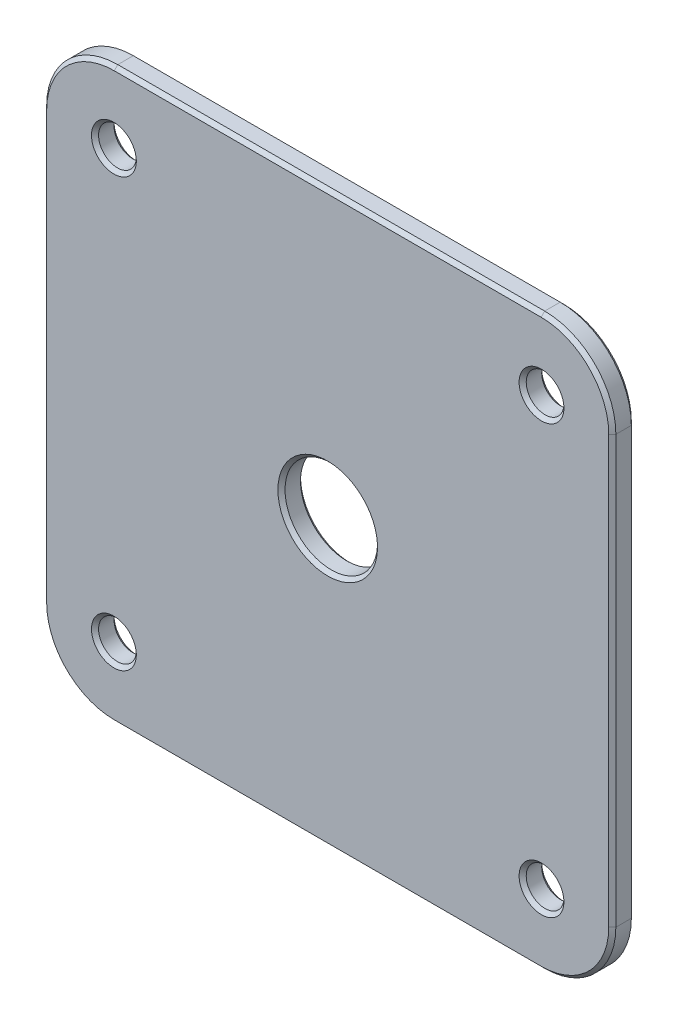
ISO-10303-21;
HEADER;
FILE_DESCRIPTION(('STEP AP214'),'2;1');
FILE_NAME('part.step','',(''),(''),'','','');
FILE_SCHEMA(('AUTOMOTIVE_DESIGN { 1 0 10303 214 1 1 1 1 }'));
ENDSEC;
DATA;
#1=APPLICATION_CONTEXT('core data for automotive mechanical design processes');
#2=APPLICATION_PROTOCOL_DEFINITION('international standard','automotive_design',2000,#1);
#3=PRODUCT_CONTEXT('',#1,'mechanical');
#4=PRODUCT('Part','Part','',(#3));
#5=PRODUCT_RELATED_PRODUCT_CATEGORY('part','',(#4));
#6=PRODUCT_DEFINITION_FORMATION('','',#4);
#7=PRODUCT_DEFINITION_CONTEXT('part definition',#1,'design');
#8=PRODUCT_DEFINITION('design','',#6,#7);
#9=PRODUCT_DEFINITION_SHAPE('','',#8);
#10=(LENGTH_UNIT() NAMED_UNIT(*) SI_UNIT(.MILLI.,.METRE.));
#11=(NAMED_UNIT(*) PLANE_ANGLE_UNIT() SI_UNIT($,.RADIAN.));
#12=(NAMED_UNIT(*) SI_UNIT($,.STERADIAN.) SOLID_ANGLE_UNIT());
#13=UNCERTAINTY_MEASURE_WITH_UNIT(LENGTH_MEASURE(1.E-05),#10,'distance_accuracy_value','');
#14=(GEOMETRIC_REPRESENTATION_CONTEXT(3) GLOBAL_UNCERTAINTY_ASSIGNED_CONTEXT((#13)) GLOBAL_UNIT_ASSIGNED_CONTEXT((#10,
#11,#12)) REPRESENTATION_CONTEXT('',''));
#15=CARTESIAN_POINT('',(0.,0.,0.));
#16=DIRECTION('',(0.,0.,1.));
#17=DIRECTION('',(1.,0.,0.));
#18=AXIS2_PLACEMENT_3D('',#15,#16,#17);
#19=CARTESIAN_POINT('',(40.,-40.,1.5875));
#20=DIRECTION('',(-1.,0.,0.));
#21=DIRECTION('',(0.,0.,1.));
#22=AXIS2_PLACEMENT_3D('',#19,#20,#21);
#23=PLANE('',#22);
#24=DIRECTION('',(0.,0.,-1.));
#25=VECTOR('',#24,1.);
#26=CARTESIAN_POINT('',(40.,30.,1.5875));
#27=LINE('',#26,#25);
#28=CARTESIAN_POINT('',(40.,30.,-1.08749999999999));
#29=VERTEX_POINT('',#28);
#30=CARTESIAN_POINT('',(40.,30.,1.0875));
#31=VERTEX_POINT('',#30);
#32=EDGE_CURVE('E352',#29,#31,#27,.F.);
#33=ORIENTED_EDGE('',*,*,#32,.T.);
#34=DIRECTION('',(0.,-1.,0.));
#35=VECTOR('',#34,1.);
#36=CARTESIAN_POINT('',(40.,-40.,1.0875));
#37=LINE('',#36,#35);
#38=CARTESIAN_POINT('',(40.,-30.,1.0875));
#39=VERTEX_POINT('',#38);
#40=EDGE_CURVE('E234',#31,#39,#37,.T.);
#41=ORIENTED_EDGE('',*,*,#40,.T.);
#42=DIRECTION('',(0.,0.,-1.));
#43=VECTOR('',#42,1.);
#44=CARTESIAN_POINT('',(40.,-30.,1.5875));
#45=LINE('',#44,#43);
#46=CARTESIAN_POINT('',(40.,-30.,-1.08749999999999));
#47=VERTEX_POINT('',#46);
#48=EDGE_CURVE('E407',#39,#47,#45,.T.);
#49=ORIENTED_EDGE('',*,*,#48,.T.);
#50=DIRECTION('',(0.,1.,0.));
#51=VECTOR('',#50,1.);
#52=CARTESIAN_POINT('',(40.,30.,-1.08749999999999));
#53=LINE('',#52,#51);
#54=EDGE_CURVE('E231',#47,#29,#53,.T.);
#55=ORIENTED_EDGE('',*,*,#54,.T.);
#56=EDGE_LOOP('',(#33,#41,#49,#55));
#57=FACE_BOUND('',#56,.T.);
#58=ADVANCED_FACE('F50',(#57),#23,.F.);
#59=CARTESIAN_POINT('',(-40.,40.,1.5875));
#60=DIRECTION('',(0.,-1.,0.));
#61=DIRECTION('',(0.,0.,-1.));
#62=AXIS2_PLACEMENT_3D('',#59,#60,#61);
#63=PLANE('',#62);
#64=DIRECTION('',(0.,0.,-1.));
#65=VECTOR('',#64,1.);
#66=CARTESIAN_POINT('',(-30.,40.,1.5875));
#67=LINE('',#66,#65);
#68=CARTESIAN_POINT('',(-30.,40.,-1.08749999999999));
#69=VERTEX_POINT('',#68);
#70=CARTESIAN_POINT('',(-30.,40.,1.0875));
#71=VERTEX_POINT('',#70);
#72=EDGE_CURVE('E426',#69,#71,#67,.F.);
#73=ORIENTED_EDGE('',*,*,#72,.T.);
#74=DIRECTION('',(1.,0.,0.));
#75=VECTOR('',#74,1.);
#76=CARTESIAN_POINT('',(-40.,40.,1.0875));
#77=LINE('',#76,#75);
#78=CARTESIAN_POINT('',(30.,40.,1.0875));
#79=VERTEX_POINT('',#78);
#80=EDGE_CURVE('E221',#71,#79,#77,.T.);
#81=ORIENTED_EDGE('',*,*,#80,.T.);
#82=DIRECTION('',(0.,0.,-1.));
#83=VECTOR('',#82,1.);
#84=CARTESIAN_POINT('',(30.,40.,1.5875));
#85=LINE('',#84,#83);
#86=CARTESIAN_POINT('',(30.,40.,-1.08749999999999));
#87=VERTEX_POINT('',#86);
#88=EDGE_CURVE('E422',#79,#87,#85,.T.);
#89=ORIENTED_EDGE('',*,*,#88,.T.);
#90=DIRECTION('',(-1.,0.,0.));
#91=VECTOR('',#90,1.);
#92=CARTESIAN_POINT('',(-30.,40.,-1.08749999999999));
#93=LINE('',#92,#91);
#94=EDGE_CURVE('E218',#87,#69,#93,.T.);
#95=ORIENTED_EDGE('',*,*,#94,.T.);
#96=EDGE_LOOP('',(#73,#81,#89,#95));
#97=FACE_BOUND('',#96,.T.);
#98=ADVANCED_FACE('F518',(#97),#63,.F.);
#99=CARTESIAN_POINT('',(-40.,-40.,1.5875));
#100=DIRECTION('',(1.,0.,0.));
#101=DIRECTION('',(0.,0.,-1.));
#102=AXIS2_PLACEMENT_3D('',#99,#100,#101);
#103=PLANE('',#102);
#104=DIRECTION('',(0.,0.,-1.));
#105=VECTOR('',#104,1.);
#106=CARTESIAN_POINT('',(-40.,-30.,1.5875));
#107=LINE('',#106,#105);
#108=CARTESIAN_POINT('',(-40.,-30.,-1.08749999999999));
#109=VERTEX_POINT('',#108);
#110=CARTESIAN_POINT('',(-40.,-30.,1.0875));
#111=VERTEX_POINT('',#110);
#112=EDGE_CURVE('E400',#109,#111,#107,.F.);
#113=ORIENTED_EDGE('',*,*,#112,.T.);
#114=DIRECTION('',(0.,1.,0.));
#115=VECTOR('',#114,1.);
#116=CARTESIAN_POINT('',(-40.,-40.,1.0875));
#117=LINE('',#116,#115);
#118=CARTESIAN_POINT('',(-40.,30.,1.0875));
#119=VERTEX_POINT('',#118);
#120=EDGE_CURVE('E209',#111,#119,#117,.T.);
#121=ORIENTED_EDGE('',*,*,#120,.T.);
#122=DIRECTION('',(0.,0.,-1.));
#123=VECTOR('',#122,1.);
#124=CARTESIAN_POINT('',(-40.,30.,1.5875));
#125=LINE('',#124,#123);
#126=CARTESIAN_POINT('',(-40.,30.,-1.08749999999999));
#127=VERTEX_POINT('',#126);
#128=EDGE_CURVE('E411',#119,#127,#125,.T.);
#129=ORIENTED_EDGE('',*,*,#128,.T.);
#130=DIRECTION('',(0.,-1.,0.));
#131=VECTOR('',#130,1.);
#132=CARTESIAN_POINT('',(-40.,-30.,-1.08749999999999));
#133=LINE('',#132,#131);
#134=EDGE_CURVE('E206',#127,#109,#133,.T.);
#135=ORIENTED_EDGE('',*,*,#134,.T.);
#136=EDGE_LOOP('',(#113,#121,#129,#135));
#137=FACE_BOUND('',#136,.T.);
#138=ADVANCED_FACE('F472',(#137),#103,.F.);
#139=CARTESIAN_POINT('',(-40.,-40.,1.5875));
#140=DIRECTION('',(0.,1.,0.));
#141=DIRECTION('',(0.,0.,1.));
#142=AXIS2_PLACEMENT_3D('',#139,#140,#141);
#143=PLANE('',#142);
#144=DIRECTION('',(0.,0.,-1.));
#145=VECTOR('',#144,1.);
#146=CARTESIAN_POINT('',(30.,-40.,1.5875));
#147=LINE('',#146,#145);
#148=CARTESIAN_POINT('',(30.,-40.,-1.08749999999999));
#149=VERTEX_POINT('',#148);
#150=CARTESIAN_POINT('',(30.,-40.,1.0875));
#151=VERTEX_POINT('',#150);
#152=EDGE_CURVE('E406',#149,#151,#147,.F.);
#153=ORIENTED_EDGE('',*,*,#152,.T.);
#154=DIRECTION('',(-1.,0.,0.));
#155=VECTOR('',#154,1.);
#156=CARTESIAN_POINT('',(-40.,-40.,1.0875));
#157=LINE('',#156,#155);
#158=CARTESIAN_POINT('',(-30.,-40.,1.0875));
#159=VERTEX_POINT('',#158);
#160=EDGE_CURVE('E246',#151,#159,#157,.T.);
#161=ORIENTED_EDGE('',*,*,#160,.T.);
#162=DIRECTION('',(0.,0.,-1.));
#163=VECTOR('',#162,1.);
#164=CARTESIAN_POINT('',(-30.,-40.,1.5875));
#165=LINE('',#164,#163);
#166=CARTESIAN_POINT('',(-30.,-40.,-1.08749999999999));
#167=VERTEX_POINT('',#166);
#168=EDGE_CURVE('E398',#159,#167,#165,.T.);
#169=ORIENTED_EDGE('',*,*,#168,.T.);
#170=DIRECTION('',(1.,0.,0.));
#171=VECTOR('',#170,1.);
#172=CARTESIAN_POINT('',(30.,-40.,-1.08749999999999));
#173=LINE('',#172,#171);
#174=EDGE_CURVE('E243',#167,#149,#173,.T.);
#175=ORIENTED_EDGE('',*,*,#174,.T.);
#176=EDGE_LOOP('',(#153,#161,#169,#175));
#177=FACE_BOUND('',#176,.T.);
#178=ADVANCED_FACE('F403',(#177),#143,.F.);
#179=CARTESIAN_POINT('',(0.,0.,1.5875));
#180=DIRECTION('',(0.,0.,-1.));
#181=DIRECTION('',(-1.,0.,0.));
#182=AXIS2_PLACEMENT_3D('',#179,#180,#181);
#183=PLANE('',#182);
#184=DIRECTION('',(0.,-1.,0.));
#185=VECTOR('',#184,1.);
#186=CARTESIAN_POINT('',(-39.5,0.,1.5875));
#187=LINE('',#186,#185);
#188=CARTESIAN_POINT('',(-39.5,30.,1.5875));
#189=VERTEX_POINT('',#188);
#190=CARTESIAN_POINT('',(-39.5,-30.,1.5875));
#191=VERTEX_POINT('',#190);
#192=EDGE_CURVE('E192',#189,#191,#187,.T.);
#193=ORIENTED_EDGE('',*,*,#192,.T.);
#194=CARTESIAN_POINT('',(-30.,-30.,1.5875));
#195=DIRECTION('',(0.,0.,-1.));
#196=DIRECTION('',(-1.,0.,0.));
#197=AXIS2_PLACEMENT_3D('',#194,#195,#196);
#198=CIRCLE('',#197,9.5);
#199=CARTESIAN_POINT('',(-30.,-39.5,1.5875));
#200=VERTEX_POINT('',#199);
#201=EDGE_CURVE('E170',#191,#200,#198,.F.);
#202=ORIENTED_EDGE('',*,*,#201,.T.);
#203=DIRECTION('',(1.,0.,0.));
#204=VECTOR('',#203,1.);
#205=CARTESIAN_POINT('',(0.,-39.5,1.5875));
#206=LINE('',#205,#204);
#207=CARTESIAN_POINT('',(30.,-39.5,1.5875));
#208=VERTEX_POINT('',#207);
#209=EDGE_CURVE('E179',#200,#208,#206,.T.);
#210=ORIENTED_EDGE('',*,*,#209,.T.);
#211=CARTESIAN_POINT('',(30.,-30.,1.5875));
#212=DIRECTION('',(0.,0.,-1.));
#213=DIRECTION('',(-1.,0.,0.));
#214=AXIS2_PLACEMENT_3D('',#211,#212,#213);
#215=CIRCLE('',#214,9.5);
#216=CARTESIAN_POINT('',(39.5,-30.,1.5875));
#217=VERTEX_POINT('',#216);
#218=EDGE_CURVE('E186',#208,#217,#215,.F.);
#219=ORIENTED_EDGE('',*,*,#218,.T.);
#220=DIRECTION('',(0.,1.,0.));
#221=VECTOR('',#220,1.);
#222=CARTESIAN_POINT('',(39.5,0.,1.5875));
#223=LINE('',#222,#221);
#224=CARTESIAN_POINT('',(39.5,30.,1.5875));
#225=VERTEX_POINT('',#224);
#226=EDGE_CURVE('E451',#217,#225,#223,.T.);
#227=ORIENTED_EDGE('',*,*,#226,.T.);
#228=CARTESIAN_POINT('',(30.,30.,1.5875));
#229=DIRECTION('',(0.,0.,-1.));
#230=DIRECTION('',(-1.,0.,0.));
#231=AXIS2_PLACEMENT_3D('',#228,#229,#230);
#232=CIRCLE('',#231,9.5);
#233=CARTESIAN_POINT('',(30.,39.5,1.5875));
#234=VERTEX_POINT('',#233);
#235=EDGE_CURVE('E454',#225,#234,#232,.F.);
#236=ORIENTED_EDGE('',*,*,#235,.T.);
#237=DIRECTION('',(-1.,0.,0.));
#238=VECTOR('',#237,1.);
#239=CARTESIAN_POINT('',(0.,39.5,1.5875));
#240=LINE('',#239,#238);
#241=CARTESIAN_POINT('',(-30.,39.5,1.5875));
#242=VERTEX_POINT('',#241);
#243=EDGE_CURVE('E457',#234,#242,#240,.T.);
#244=ORIENTED_EDGE('',*,*,#243,.T.);
#245=CARTESIAN_POINT('',(-30.,30.,1.5875));
#246=DIRECTION('',(0.,0.,-1.));
#247=DIRECTION('',(-1.,0.,0.));
#248=AXIS2_PLACEMENT_3D('',#245,#246,#247);
#249=CIRCLE('',#248,9.5);
#250=EDGE_CURVE('E200',#242,#189,#249,.F.);
#251=ORIENTED_EDGE('',*,*,#250,.T.);
#252=EDGE_LOOP('',(#193,#202,#210,#219,#227,#236,#244,#251));
#253=FACE_BOUND('',#252,.T.);
#254=CARTESIAN_POINT('',(-30.0520382004283,-30.0520382004283,1.5875));
#255=DIRECTION('',(0.,0.,-1.));
#256=DIRECTION('',(-1.,0.,0.));
#257=AXIS2_PLACEMENT_3D('',#254,#255,#256);
#258=CIRCLE('',#257,3.14999999999999);
#259=CARTESIAN_POINT('',(-33.2020382004283,-30.0520382004283,1.5875));
#260=VERTEX_POINT('',#259);
#261=EDGE_CURVE('E187',#260,#260,#258,.T.);
#262=ORIENTED_EDGE('',*,*,#261,.T.);
#263=EDGE_LOOP('',(#262));
#264=FACE_BOUND('',#263,.T.);
#265=CARTESIAN_POINT('',(30.0520382004283,-30.0520382004283,1.5875));
#266=DIRECTION('',(0.,0.,-1.));
#267=DIRECTION('',(-1.,0.,0.));
#268=AXIS2_PLACEMENT_3D('',#265,#266,#267);
#269=CIRCLE('',#268,3.14999999999998);
#270=CARTESIAN_POINT('',(26.9020382004283,-30.0520382004283,1.5875));
#271=VERTEX_POINT('',#270);
#272=EDGE_CURVE('E442',#271,#271,#269,.T.);
#273=ORIENTED_EDGE('',*,*,#272,.T.);
#274=EDGE_LOOP('',(#273));
#275=FACE_BOUND('',#274,.T.);
#276=CARTESIAN_POINT('',(30.0520382004283,30.0520382004283,1.5875));
#277=DIRECTION('',(0.,0.,-1.));
#278=DIRECTION('',(-1.,0.,0.));
#279=AXIS2_PLACEMENT_3D('',#276,#277,#278);
#280=CIRCLE('',#279,3.14999999999998);
#281=CARTESIAN_POINT('',(26.9020382004283,30.0520382004283,1.5875));
#282=VERTEX_POINT('',#281);
#283=EDGE_CURVE('E438',#282,#282,#280,.T.);
#284=ORIENTED_EDGE('',*,*,#283,.T.);
#285=EDGE_LOOP('',(#284));
#286=FACE_BOUND('',#285,.T.);
#287=CARTESIAN_POINT('',(-30.0520382004283,30.0520382004283,1.5875));
#288=DIRECTION('',(0.,0.,-1.));
#289=DIRECTION('',(-1.,0.,0.));
#290=AXIS2_PLACEMENT_3D('',#287,#288,#289);
#291=CIRCLE('',#290,3.14999999999999);
#292=CARTESIAN_POINT('',(-33.2020382004283,30.0520382004283,1.5875));
#293=VERTEX_POINT('',#292);
#294=EDGE_CURVE('E434',#293,#293,#291,.T.);
#295=ORIENTED_EDGE('',*,*,#294,.T.);
#296=EDGE_LOOP('',(#295));
#297=FACE_BOUND('',#296,.T.);
#298=CARTESIAN_POINT('',(0.,0.,1.5875));
#299=DIRECTION('',(0.,0.,-1.));
#300=DIRECTION('',(-1.,0.,0.));
#301=AXIS2_PLACEMENT_3D('',#298,#299,#300);
#302=CIRCLE('',#301,6.99999999999999);
#303=CARTESIAN_POINT('',(-6.99999999999999,0.,1.5875));
#304=VERTEX_POINT('',#303);
#305=EDGE_CURVE('E430',#304,#304,#302,.T.);
#306=ORIENTED_EDGE('',*,*,#305,.T.);
#307=EDGE_LOOP('',(#306));
#308=FACE_BOUND('',#307,.T.);
#309=ADVANCED_FACE('F189',(#253,#264,#275,#286,#297,#308),#183,.F.);
#310=CARTESIAN_POINT('',(0.,0.,-1.5875));
#311=DIRECTION('',(0.,0.,-1.));
#312=DIRECTION('',(-1.,0.,0.));
#313=AXIS2_PLACEMENT_3D('',#310,#311,#312);
#314=PLANE('',#313);
#315=DIRECTION('',(1.,0.,0.));
#316=VECTOR('',#315,1.);
#317=CARTESIAN_POINT('',(30.,39.5,-1.5875));
#318=LINE('',#317,#316);
#319=CARTESIAN_POINT('',(-30.,39.5,-1.5875));
#320=VERTEX_POINT('',#319);
#321=CARTESIAN_POINT('',(30.,39.5,-1.5875));
#322=VERTEX_POINT('',#321);
#323=EDGE_CURVE('E61',#320,#322,#318,.T.);
#324=ORIENTED_EDGE('',*,*,#323,.T.);
#325=CARTESIAN_POINT('',(30.,30.,-1.5875));
#326=DIRECTION('',(0.,0.,-1.));
#327=DIRECTION('',(-1.,0.,0.));
#328=AXIS2_PLACEMENT_3D('',#325,#326,#327);
#329=CIRCLE('',#328,9.49999999999999);
#330=CARTESIAN_POINT('',(39.5,30.,-1.5875));
#331=VERTEX_POINT('',#330);
#332=EDGE_CURVE('E12',#322,#331,#329,.T.);
#333=ORIENTED_EDGE('',*,*,#332,.T.);
#334=DIRECTION('',(0.,-1.,0.));
#335=VECTOR('',#334,1.);
#336=CARTESIAN_POINT('',(39.5,-30.,-1.5875));
#337=LINE('',#336,#335);
#338=CARTESIAN_POINT('',(39.5,-30.,-1.5875));
#339=VERTEX_POINT('',#338);
#340=EDGE_CURVE('E309',#331,#339,#337,.T.);
#341=ORIENTED_EDGE('',*,*,#340,.T.);
#342=CARTESIAN_POINT('',(30.,-30.,-1.5875));
#343=DIRECTION('',(0.,0.,-1.));
#344=DIRECTION('',(-1.,0.,0.));
#345=AXIS2_PLACEMENT_3D('',#342,#343,#344);
#346=CIRCLE('',#345,9.49999999999999);
#347=CARTESIAN_POINT('',(30.,-39.5,-1.5875));
#348=VERTEX_POINT('',#347);
#349=EDGE_CURVE('E312',#339,#348,#346,.T.);
#350=ORIENTED_EDGE('',*,*,#349,.T.);
#351=DIRECTION('',(-1.,0.,0.));
#352=VECTOR('',#351,1.);
#353=CARTESIAN_POINT('',(-30.,-39.5,-1.5875));
#354=LINE('',#353,#352);
#355=CARTESIAN_POINT('',(-30.,-39.5,-1.5875));
#356=VERTEX_POINT('',#355);
#357=EDGE_CURVE('E315',#348,#356,#354,.T.);
#358=ORIENTED_EDGE('',*,*,#357,.T.);
#359=CARTESIAN_POINT('',(-30.,-30.,-1.5875));
#360=DIRECTION('',(0.,0.,-1.));
#361=DIRECTION('',(-1.,0.,0.));
#362=AXIS2_PLACEMENT_3D('',#359,#360,#361);
#363=CIRCLE('',#362,9.49999999999999);
#364=CARTESIAN_POINT('',(-39.5,-30.,-1.5875));
#365=VERTEX_POINT('',#364);
#366=EDGE_CURVE('E318',#356,#365,#363,.T.);
#367=ORIENTED_EDGE('',*,*,#366,.T.);
#368=DIRECTION('',(0.,1.,0.));
#369=VECTOR('',#368,1.);
#370=CARTESIAN_POINT('',(-39.5,30.,-1.5875));
#371=LINE('',#370,#369);
#372=CARTESIAN_POINT('',(-39.5,30.,-1.5875));
#373=VERTEX_POINT('',#372);
#374=EDGE_CURVE('E321',#365,#373,#371,.T.);
#375=ORIENTED_EDGE('',*,*,#374,.T.);
#376=CARTESIAN_POINT('',(-30.,30.,-1.5875));
#377=DIRECTION('',(0.,0.,-1.));
#378=DIRECTION('',(-1.,0.,0.));
#379=AXIS2_PLACEMENT_3D('',#376,#377,#378);
#380=CIRCLE('',#379,9.49999999999999);
#381=EDGE_CURVE('E72',#373,#320,#380,.T.);
#382=ORIENTED_EDGE('',*,*,#381,.T.);
#383=EDGE_LOOP('',(#324,#333,#341,#350,#358,#367,#375,#382));
#384=FACE_BOUND('',#383,.T.);
#385=CARTESIAN_POINT('',(-30.0520382004283,-30.0520382004283,-1.5875));
#386=DIRECTION('',(0.,0.,-1.));
#387=DIRECTION('',(-1.,0.,0.));
#388=AXIS2_PLACEMENT_3D('',#385,#386,#387);
#389=CIRCLE('',#388,3.14999999999999);
#390=CARTESIAN_POINT('',(-33.2020382004283,-30.0520382004283,-1.5875));
#391=VERTEX_POINT('',#390);
#392=EDGE_CURVE('E305',#391,#391,#389,.F.);
#393=ORIENTED_EDGE('',*,*,#392,.T.);
#394=EDGE_LOOP('',(#393));
#395=FACE_BOUND('',#394,.T.);
#396=CARTESIAN_POINT('',(30.0520382004283,-30.0520382004283,-1.5875));
#397=DIRECTION('',(0.,0.,-1.));
#398=DIRECTION('',(-1.,0.,0.));
#399=AXIS2_PLACEMENT_3D('',#396,#397,#398);
#400=CIRCLE('',#399,3.14999999999998);
#401=CARTESIAN_POINT('',(26.9020382004283,-30.0520382004283,-1.5875));
#402=VERTEX_POINT('',#401);
#403=EDGE_CURVE('E301',#402,#402,#400,.F.);
#404=ORIENTED_EDGE('',*,*,#403,.T.);
#405=EDGE_LOOP('',(#404));
#406=FACE_BOUND('',#405,.T.);
#407=CARTESIAN_POINT('',(30.0520382004283,30.0520382004283,-1.5875));
#408=DIRECTION('',(0.,0.,-1.));
#409=DIRECTION('',(-1.,0.,0.));
#410=AXIS2_PLACEMENT_3D('',#407,#408,#409);
#411=CIRCLE('',#410,3.14999999999998);
#412=CARTESIAN_POINT('',(26.9020382004283,30.0520382004283,-1.5875));
#413=VERTEX_POINT('',#412);
#414=EDGE_CURVE('E297',#413,#413,#411,.F.);
#415=ORIENTED_EDGE('',*,*,#414,.T.);
#416=EDGE_LOOP('',(#415));
#417=FACE_BOUND('',#416,.T.);
#418=CARTESIAN_POINT('',(-30.0520382004283,30.0520382004283,-1.5875));
#419=DIRECTION('',(0.,0.,-1.));
#420=DIRECTION('',(-1.,0.,0.));
#421=AXIS2_PLACEMENT_3D('',#418,#419,#420);
#422=CIRCLE('',#421,3.14999999999999);
#423=CARTESIAN_POINT('',(-33.2020382004283,30.0520382004283,-1.5875));
#424=VERTEX_POINT('',#423);
#425=EDGE_CURVE('E293',#424,#424,#422,.F.);
#426=ORIENTED_EDGE('',*,*,#425,.T.);
#427=EDGE_LOOP('',(#426));
#428=FACE_BOUND('',#427,.T.);
#429=CARTESIAN_POINT('',(0.,0.,-1.5875));
#430=DIRECTION('',(0.,0.,-1.));
#431=DIRECTION('',(-1.,0.,0.));
#432=AXIS2_PLACEMENT_3D('',#429,#430,#431);
#433=CIRCLE('',#432,7.00000000000001);
#434=CARTESIAN_POINT('',(-7.00000000000001,0.,-1.5875));
#435=VERTEX_POINT('',#434);
#436=EDGE_CURVE('E289',#435,#435,#433,.F.);
#437=ORIENTED_EDGE('',*,*,#436,.T.);
#438=EDGE_LOOP('',(#437));
#439=FACE_BOUND('',#438,.T.);
#440=ADVANCED_FACE('F488',(#384,#395,#406,#417,#428,#439),#314,.T.);
#441=CARTESIAN_POINT('',(-30.0520382004283,-30.0520382004283,-1.5875));
#442=DIRECTION('',(0.,0.,-1.));
#443=DIRECTION('',(-1.,0.,0.));
#444=AXIS2_PLACEMENT_3D('',#441,#442,#443);
#445=CYLINDRICAL_SURFACE('',#444,2.64999999999999);
#446=CARTESIAN_POINT('',(-30.0520382004283,-30.0520382004283,1.08750000000001));
#447=DIRECTION('',(0.,0.,-1.));
#448=DIRECTION('',(-1.,0.,0.));
#449=AXIS2_PLACEMENT_3D('',#446,#447,#448);
#450=CIRCLE('',#449,2.64999999999999);
#451=CARTESIAN_POINT('',(-32.7020382004283,-30.0520382004283,1.08750000000001));
#452=VERTEX_POINT('',#451);
#453=EDGE_CURVE('E253',#452,#452,#450,.F.);
#454=ORIENTED_EDGE('',*,*,#453,.T.);
#455=EDGE_LOOP('',(#454));
#456=FACE_BOUND('',#455,.T.);
#457=CARTESIAN_POINT('',(-30.0520382004283,-30.0520382004283,-1.08750000000001));
#458=DIRECTION('',(0.,0.,-1.));
#459=DIRECTION('',(-1.,0.,0.));
#460=AXIS2_PLACEMENT_3D('',#457,#458,#459);
#461=CIRCLE('',#460,2.64999999999999);
#462=CARTESIAN_POINT('',(-32.7020382004283,-30.0520382004283,-1.08750000000001));
#463=VERTEX_POINT('',#462);
#464=EDGE_CURVE('E249',#463,#463,#461,.T.);
#465=ORIENTED_EDGE('',*,*,#464,.T.);
#466=EDGE_LOOP('',(#465));
#467=FACE_BOUND('',#466,.T.);
#468=ADVANCED_FACE('F711',(#456,#467),#445,.F.);
#469=CARTESIAN_POINT('',(30.0520382004283,-30.0520382004283,-1.5875));
#470=DIRECTION('',(0.,0.,-1.));
#471=DIRECTION('',(-1.,0.,0.));
#472=AXIS2_PLACEMENT_3D('',#469,#470,#471);
#473=CYLINDRICAL_SURFACE('',#472,2.64999999999999);
#474=CARTESIAN_POINT('',(30.0520382004283,-30.0520382004283,1.08750000000001));
#475=DIRECTION('',(0.,0.,-1.));
#476=DIRECTION('',(-1.,0.,0.));
#477=AXIS2_PLACEMENT_3D('',#474,#475,#476);
#478=CIRCLE('',#477,2.64999999999999);
#479=CARTESIAN_POINT('',(27.4020382004283,-30.0520382004283,1.08750000000001));
#480=VERTEX_POINT('',#479);
#481=EDGE_CURVE('E261',#480,#480,#478,.F.);
#482=ORIENTED_EDGE('',*,*,#481,.T.);
#483=EDGE_LOOP('',(#482));
#484=FACE_BOUND('',#483,.T.);
#485=CARTESIAN_POINT('',(30.0520382004283,-30.0520382004283,-1.08750000000001));
#486=DIRECTION('',(0.,0.,-1.));
#487=DIRECTION('',(-1.,0.,0.));
#488=AXIS2_PLACEMENT_3D('',#485,#486,#487);
#489=CIRCLE('',#488,2.64999999999999);
#490=CARTESIAN_POINT('',(27.4020382004283,-30.0520382004283,-1.08750000000001));
#491=VERTEX_POINT('',#490);
#492=EDGE_CURVE('E257',#491,#491,#489,.T.);
#493=ORIENTED_EDGE('',*,*,#492,.T.);
#494=EDGE_LOOP('',(#493));
#495=FACE_BOUND('',#494,.T.);
#496=ADVANCED_FACE('F705',(#484,#495),#473,.F.);
#497=CARTESIAN_POINT('',(30.0520382004283,30.0520382004283,-1.5875));
#498=DIRECTION('',(0.,0.,-1.));
#499=DIRECTION('',(-1.,0.,0.));
#500=AXIS2_PLACEMENT_3D('',#497,#498,#499);
#501=CYLINDRICAL_SURFACE('',#500,2.64999999999999);
#502=CARTESIAN_POINT('',(30.0520382004283,30.0520382004283,1.08750000000001));
#503=DIRECTION('',(0.,0.,-1.));
#504=DIRECTION('',(-1.,0.,0.));
#505=AXIS2_PLACEMENT_3D('',#502,#503,#504);
#506=CIRCLE('',#505,2.64999999999999);
#507=CARTESIAN_POINT('',(27.4020382004283,30.0520382004283,1.08750000000001));
#508=VERTEX_POINT('',#507);
#509=EDGE_CURVE('E269',#508,#508,#506,.F.);
#510=ORIENTED_EDGE('',*,*,#509,.T.);
#511=EDGE_LOOP('',(#510));
#512=FACE_BOUND('',#511,.T.);
#513=CARTESIAN_POINT('',(30.0520382004283,30.0520382004283,-1.08750000000001));
#514=DIRECTION('',(0.,0.,-1.));
#515=DIRECTION('',(-1.,0.,0.));
#516=AXIS2_PLACEMENT_3D('',#513,#514,#515);
#517=CIRCLE('',#516,2.64999999999999);
#518=CARTESIAN_POINT('',(27.4020382004283,30.0520382004283,-1.08750000000001));
#519=VERTEX_POINT('',#518);
#520=EDGE_CURVE('E265',#519,#519,#517,.T.);
#521=ORIENTED_EDGE('',*,*,#520,.T.);
#522=EDGE_LOOP('',(#521));
#523=FACE_BOUND('',#522,.T.);
#524=ADVANCED_FACE('F696',(#512,#523),#501,.F.);
#525=CARTESIAN_POINT('',(-30.0520382004283,30.0520382004283,-1.5875));
#526=DIRECTION('',(0.,0.,-1.));
#527=DIRECTION('',(-1.,0.,0.));
#528=AXIS2_PLACEMENT_3D('',#525,#526,#527);
#529=CYLINDRICAL_SURFACE('',#528,2.64999999999999);
#530=CARTESIAN_POINT('',(-30.0520382004283,30.0520382004283,1.08750000000001));
#531=DIRECTION('',(0.,0.,-1.));
#532=DIRECTION('',(-1.,0.,0.));
#533=AXIS2_PLACEMENT_3D('',#530,#531,#532);
#534=CIRCLE('',#533,2.64999999999999);
#535=CARTESIAN_POINT('',(-32.7020382004283,30.0520382004283,1.08750000000001));
#536=VERTEX_POINT('',#535);
#537=EDGE_CURVE('E277',#536,#536,#534,.F.);
#538=ORIENTED_EDGE('',*,*,#537,.T.);
#539=EDGE_LOOP('',(#538));
#540=FACE_BOUND('',#539,.T.);
#541=CARTESIAN_POINT('',(-30.0520382004283,30.0520382004283,-1.08750000000001));
#542=DIRECTION('',(0.,0.,-1.));
#543=DIRECTION('',(-1.,0.,0.));
#544=AXIS2_PLACEMENT_3D('',#541,#542,#543);
#545=CIRCLE('',#544,2.64999999999999);
#546=CARTESIAN_POINT('',(-32.7020382004283,30.0520382004283,-1.08750000000001));
#547=VERTEX_POINT('',#546);
#548=EDGE_CURVE('E273',#547,#547,#545,.T.);
#549=ORIENTED_EDGE('',*,*,#548,.T.);
#550=EDGE_LOOP('',(#549));
#551=FACE_BOUND('',#550,.T.);
#552=ADVANCED_FACE('F694',(#540,#551),#529,.F.);
#553=CARTESIAN_POINT('',(0.,0.,1.5875));
#554=DIRECTION('',(0.,0.,1.));
#555=DIRECTION('',(1.,0.,0.));
#556=AXIS2_PLACEMENT_3D('',#553,#554,#555);
#557=CYLINDRICAL_SURFACE('',#556,6.49999999999999);
#558=CARTESIAN_POINT('',(0.,0.,1.08749999999999));
#559=DIRECTION('',(0.,0.,-1.));
#560=DIRECTION('',(-1.,0.,0.));
#561=AXIS2_PLACEMENT_3D('',#558,#559,#560);
#562=CIRCLE('',#561,6.49999999999999);
#563=CARTESIAN_POINT('',(-6.49999999999999,0.,1.08749999999999));
#564=VERTEX_POINT('',#563);
#565=EDGE_CURVE('E285',#564,#564,#562,.F.);
#566=ORIENTED_EDGE('',*,*,#565,.T.);
#567=EDGE_LOOP('',(#566));
#568=FACE_BOUND('',#567,.T.);
#569=CARTESIAN_POINT('',(0.,0.,-1.08749999999998));
#570=DIRECTION('',(0.,0.,-1.));
#571=DIRECTION('',(-1.,0.,0.));
#572=AXIS2_PLACEMENT_3D('',#569,#570,#571);
#573=CIRCLE('',#572,6.49999999999999);
#574=CARTESIAN_POINT('',(-6.49999999999999,0.,-1.08749999999998));
#575=VERTEX_POINT('',#574);
#576=EDGE_CURVE('E281',#575,#575,#573,.T.);
#577=ORIENTED_EDGE('',*,*,#576,.T.);
#578=EDGE_LOOP('',(#577));
#579=FACE_BOUND('',#578,.T.);
#580=ADVANCED_FACE('F532',(#568,#579),#557,.F.);
#581=CARTESIAN_POINT('',(30.,-30.,1.5875));
#582=DIRECTION('',(0.,0.,-1.));
#583=DIRECTION('',(-1.,0.,0.));
#584=AXIS2_PLACEMENT_3D('',#581,#582,#583);
#585=CYLINDRICAL_SURFACE('',#584,10.);
#586=ORIENTED_EDGE('',*,*,#48,.F.);
#587=CARTESIAN_POINT('',(30.,-30.,1.0875));
#588=DIRECTION('',(0.,0.,-1.));
#589=DIRECTION('',(-1.,0.,0.));
#590=AXIS2_PLACEMENT_3D('',#587,#588,#589);
#591=CIRCLE('',#590,10.);
#592=EDGE_CURVE('E240',#39,#151,#591,.T.);
#593=ORIENTED_EDGE('',*,*,#592,.T.);
#594=ORIENTED_EDGE('',*,*,#152,.F.);
#595=CARTESIAN_POINT('',(30.,-30.,-1.08749999999999));
#596=DIRECTION('',(0.,0.,-1.));
#597=DIRECTION('',(-1.,0.,0.));
#598=AXIS2_PLACEMENT_3D('',#595,#596,#597);
#599=CIRCLE('',#598,10.);
#600=EDGE_CURVE('E237',#149,#47,#599,.F.);
#601=ORIENTED_EDGE('',*,*,#600,.T.);
#602=EDGE_LOOP('',(#586,#593,#594,#601));
#603=FACE_BOUND('',#602,.T.);
#604=ADVANCED_FACE('F529',(#603),#585,.T.);
#605=CARTESIAN_POINT('',(-30.,-30.,1.5875));
#606=DIRECTION('',(0.,0.,-1.));
#607=DIRECTION('',(-1.,0.,0.));
#608=AXIS2_PLACEMENT_3D('',#605,#606,#607);
#609=CYLINDRICAL_SURFACE('',#608,10.);
#610=ORIENTED_EDGE('',*,*,#168,.F.);
#611=CARTESIAN_POINT('',(-30.,-30.,1.0875));
#612=DIRECTION('',(0.,0.,-1.));
#613=DIRECTION('',(-1.,0.,0.));
#614=AXIS2_PLACEMENT_3D('',#611,#612,#613);
#615=CIRCLE('',#614,10.);
#616=EDGE_CURVE('E172',#159,#111,#615,.T.);
#617=ORIENTED_EDGE('',*,*,#616,.T.);
#618=ORIENTED_EDGE('',*,*,#112,.F.);
#619=CARTESIAN_POINT('',(-30.,-30.,-1.08749999999999));
#620=DIRECTION('',(0.,0.,-1.));
#621=DIRECTION('',(-1.,0.,0.));
#622=AXIS2_PLACEMENT_3D('',#619,#620,#621);
#623=CIRCLE('',#622,10.);
#624=EDGE_CURVE('E195',#109,#167,#623,.F.);
#625=ORIENTED_EDGE('',*,*,#624,.T.);
#626=EDGE_LOOP('',(#610,#617,#618,#625));
#627=FACE_BOUND('',#626,.T.);
#628=ADVANCED_FACE('F397',(#627),#609,.T.);
#629=CARTESIAN_POINT('',(-30.,30.,1.5875));
#630=DIRECTION('',(0.,0.,-1.));
#631=DIRECTION('',(-1.,0.,0.));
#632=AXIS2_PLACEMENT_3D('',#629,#630,#631);
#633=CYLINDRICAL_SURFACE('',#632,10.);
#634=ORIENTED_EDGE('',*,*,#128,.F.);
#635=CARTESIAN_POINT('',(-30.,30.,1.0875));
#636=DIRECTION('',(0.,0.,-1.));
#637=DIRECTION('',(-1.,0.,0.));
#638=AXIS2_PLACEMENT_3D('',#635,#636,#637);
#639=CIRCLE('',#638,10.);
#640=EDGE_CURVE('E215',#119,#71,#639,.T.);
#641=ORIENTED_EDGE('',*,*,#640,.T.);
#642=ORIENTED_EDGE('',*,*,#72,.F.);
#643=CARTESIAN_POINT('',(-30.,30.,-1.08749999999999));
#644=DIRECTION('',(0.,0.,-1.));
#645=DIRECTION('',(-1.,0.,0.));
#646=AXIS2_PLACEMENT_3D('',#643,#644,#645);
#647=CIRCLE('',#646,10.);
#648=EDGE_CURVE('E212',#69,#127,#647,.F.);
#649=ORIENTED_EDGE('',*,*,#648,.T.);
#650=EDGE_LOOP('',(#634,#641,#642,#649));
#651=FACE_BOUND('',#650,.T.);
#652=ADVANCED_FACE('F474',(#651),#633,.T.);
#653=CARTESIAN_POINT('',(30.,30.,1.5875));
#654=DIRECTION('',(0.,0.,-1.));
#655=DIRECTION('',(-1.,0.,0.));
#656=AXIS2_PLACEMENT_3D('',#653,#654,#655);
#657=CYLINDRICAL_SURFACE('',#656,10.);
#658=ORIENTED_EDGE('',*,*,#88,.F.);
#659=CARTESIAN_POINT('',(30.,30.,1.0875));
#660=DIRECTION('',(0.,0.,-1.));
#661=DIRECTION('',(-1.,0.,0.));
#662=AXIS2_PLACEMENT_3D('',#659,#660,#661);
#663=CIRCLE('',#662,10.);
#664=EDGE_CURVE('E228',#79,#31,#663,.T.);
#665=ORIENTED_EDGE('',*,*,#664,.T.);
#666=ORIENTED_EDGE('',*,*,#32,.F.);
#667=CARTESIAN_POINT('',(30.,30.,-1.08749999999999));
#668=DIRECTION('',(0.,0.,-1.));
#669=DIRECTION('',(-1.,0.,0.));
#670=AXIS2_PLACEMENT_3D('',#667,#668,#669);
#671=CIRCLE('',#670,10.);
#672=EDGE_CURVE('E224',#29,#87,#671,.F.);
#673=ORIENTED_EDGE('',*,*,#672,.T.);
#674=EDGE_LOOP('',(#658,#665,#666,#673));
#675=FACE_BOUND('',#674,.T.);
#676=ADVANCED_FACE('F506',(#675),#657,.T.);
#677=CARTESIAN_POINT('',(30.,30.,1.5875));
#678=DIRECTION('',(0.,0.,-1.));
#679=DIRECTION('',(-1.,0.,0.));
#680=AXIS2_PLACEMENT_3D('',#677,#678,#679);
#681=CONICAL_SURFACE('',#680,9.5,0.785398163397447);
#682=DIRECTION('',(-0.707106781186547,0.,0.707106781186547));
#683=VECTOR('',#682,1.);
#684=CARTESIAN_POINT('',(40.,30.,1.0875));
#685=LINE('',#684,#683);
#686=EDGE_CURVE('E344',#31,#225,#685,.T.);
#687=ORIENTED_EDGE('',*,*,#686,.F.);
#688=ORIENTED_EDGE('',*,*,#664,.F.);
#689=DIRECTION('',(0.,0.707106781186547,-0.707106781186547));
#690=VECTOR('',#689,1.);
#691=CARTESIAN_POINT('',(30.,39.5,1.5875));
#692=LINE('',#691,#690);
#693=EDGE_CURVE('E348',#234,#79,#692,.T.);
#694=ORIENTED_EDGE('',*,*,#693,.F.);
#695=ORIENTED_EDGE('',*,*,#235,.F.);
#696=EDGE_LOOP('',(#687,#688,#694,#695));
#697=FACE_BOUND('',#696,.T.);
#698=ADVANCED_FACE('F511',(#697),#681,.T.);
#699=CARTESIAN_POINT('',(0.,39.5,1.5875));
#700=DIRECTION('',(0.,-0.707106781186547,-0.707106781186547));
#701=DIRECTION('',(-1.,0.,0.));
#702=AXIS2_PLACEMENT_3D('',#699,#700,#701);
#703=PLANE('',#702);
#704=ORIENTED_EDGE('',*,*,#693,.T.);
#705=ORIENTED_EDGE('',*,*,#80,.F.);
#706=DIRECTION('',(0.,0.707106781186547,-0.707106781186547));
#707=VECTOR('',#706,1.);
#708=CARTESIAN_POINT('',(-30.,39.5,1.5875));
#709=LINE('',#708,#707);
#710=EDGE_CURVE('E340',#242,#71,#709,.T.);
#711=ORIENTED_EDGE('',*,*,#710,.F.);
#712=ORIENTED_EDGE('',*,*,#243,.F.);
#713=EDGE_LOOP('',(#704,#705,#711,#712));
#714=FACE_BOUND('',#713,.T.);
#715=ADVANCED_FACE('F516',(#714),#703,.F.);
#716=CARTESIAN_POINT('',(39.5,0.,1.5875));
#717=DIRECTION('',(-0.707106781186547,0.,-0.707106781186547));
#718=DIRECTION('',(0.,1.,0.));
#719=AXIS2_PLACEMENT_3D('',#716,#717,#718);
#720=PLANE('',#719);
#721=ORIENTED_EDGE('',*,*,#686,.T.);
#722=ORIENTED_EDGE('',*,*,#226,.F.);
#723=DIRECTION('',(-0.707106781186547,0.,0.707106781186547));
#724=VECTOR('',#723,1.);
#725=CARTESIAN_POINT('',(40.,-30.,1.0875));
#726=LINE('',#725,#724);
#727=EDGE_CURVE('E336',#39,#217,#726,.T.);
#728=ORIENTED_EDGE('',*,*,#727,.F.);
#729=ORIENTED_EDGE('',*,*,#40,.F.);
#730=EDGE_LOOP('',(#721,#722,#728,#729));
#731=FACE_BOUND('',#730,.T.);
#732=ADVANCED_FACE('F570',(#731),#720,.F.);
#733=CARTESIAN_POINT('',(-30.,30.,1.5875));
#734=DIRECTION('',(0.,0.,-1.));
#735=DIRECTION('',(-1.,0.,0.));
#736=AXIS2_PLACEMENT_3D('',#733,#734,#735);
#737=CONICAL_SURFACE('',#736,9.5,0.785398163397447);
#738=ORIENTED_EDGE('',*,*,#710,.T.);
#739=ORIENTED_EDGE('',*,*,#640,.F.);
#740=DIRECTION('',(-0.707106781186547,0.,-0.707106781186547));
#741=VECTOR('',#740,1.);
#742=CARTESIAN_POINT('',(-39.5,30.,1.5875));
#743=LINE('',#742,#741);
#744=EDGE_CURVE('E332',#189,#119,#743,.T.);
#745=ORIENTED_EDGE('',*,*,#744,.F.);
#746=ORIENTED_EDGE('',*,*,#250,.F.);
#747=EDGE_LOOP('',(#738,#739,#745,#746));
#748=FACE_BOUND('',#747,.T.);
#749=ADVANCED_FACE('F466',(#748),#737,.T.);
#750=CARTESIAN_POINT('',(30.,-30.,1.5875));
#751=DIRECTION('',(0.,0.,-1.));
#752=DIRECTION('',(-1.,0.,0.));
#753=AXIS2_PLACEMENT_3D('',#750,#751,#752);
#754=CONICAL_SURFACE('',#753,9.5,0.785398163397447);
#755=ORIENTED_EDGE('',*,*,#727,.T.);
#756=ORIENTED_EDGE('',*,*,#218,.F.);
#757=DIRECTION('',(0.,0.707106781186547,0.707106781186547));
#758=VECTOR('',#757,1.);
#759=CARTESIAN_POINT('',(30.,-40.,1.0875));
#760=LINE('',#759,#758);
#761=EDGE_CURVE('E182',#151,#208,#760,.T.);
#762=ORIENTED_EDGE('',*,*,#761,.F.);
#763=ORIENTED_EDGE('',*,*,#592,.F.);
#764=EDGE_LOOP('',(#755,#756,#762,#763));
#765=FACE_BOUND('',#764,.T.);
#766=ADVANCED_FACE('F558',(#765),#754,.T.);
#767=CARTESIAN_POINT('',(-39.5,0.,1.5875));
#768=DIRECTION('',(0.707106781186547,0.,-0.707106781186547));
#769=DIRECTION('',(0.,-1.,0.));
#770=AXIS2_PLACEMENT_3D('',#767,#768,#769);
#771=PLANE('',#770);
#772=ORIENTED_EDGE('',*,*,#744,.T.);
#773=ORIENTED_EDGE('',*,*,#120,.F.);
#774=DIRECTION('',(-0.707106781186547,0.,-0.707106781186547));
#775=VECTOR('',#774,1.);
#776=CARTESIAN_POINT('',(-39.5,-30.,1.5875));
#777=LINE('',#776,#775);
#778=EDGE_CURVE('E176',#191,#111,#777,.T.);
#779=ORIENTED_EDGE('',*,*,#778,.F.);
#780=ORIENTED_EDGE('',*,*,#192,.F.);
#781=EDGE_LOOP('',(#772,#773,#779,#780));
#782=FACE_BOUND('',#781,.T.);
#783=ADVANCED_FACE('F469',(#782),#771,.F.);
#784=CARTESIAN_POINT('',(0.,-39.5,1.5875));
#785=DIRECTION('',(0.,0.707106781186547,-0.707106781186547));
#786=DIRECTION('',(1.,0.,0.));
#787=AXIS2_PLACEMENT_3D('',#784,#785,#786);
#788=PLANE('',#787);
#789=ORIENTED_EDGE('',*,*,#761,.T.);
#790=ORIENTED_EDGE('',*,*,#209,.F.);
#791=DIRECTION('',(0.,0.707106781186547,0.707106781186547));
#792=VECTOR('',#791,1.);
#793=CARTESIAN_POINT('',(-30.,-40.,1.0875));
#794=LINE('',#793,#792);
#795=EDGE_CURVE('E166',#159,#200,#794,.T.);
#796=ORIENTED_EDGE('',*,*,#795,.F.);
#797=ORIENTED_EDGE('',*,*,#160,.F.);
#798=EDGE_LOOP('',(#789,#790,#796,#797));
#799=FACE_BOUND('',#798,.T.);
#800=ADVANCED_FACE('F180',(#799),#788,.F.);
#801=CARTESIAN_POINT('',(-30.,-30.,1.5875));
#802=DIRECTION('',(0.,0.,-1.));
#803=DIRECTION('',(-1.,0.,0.));
#804=AXIS2_PLACEMENT_3D('',#801,#802,#803);
#805=CONICAL_SURFACE('',#804,9.5,0.785398163397447);
#806=ORIENTED_EDGE('',*,*,#778,.T.);
#807=ORIENTED_EDGE('',*,*,#616,.F.);
#808=ORIENTED_EDGE('',*,*,#795,.T.);
#809=ORIENTED_EDGE('',*,*,#201,.F.);
#810=EDGE_LOOP('',(#806,#807,#808,#809));
#811=FACE_BOUND('',#810,.T.);
#812=ADVANCED_FACE('F168',(#811),#805,.T.);
#813=CARTESIAN_POINT('',(-30.0520382004283,-30.0520382004283,1.5875));
#814=DIRECTION('',(0.,0.,1.));
#815=DIRECTION('',(1.,0.,0.));
#816=AXIS2_PLACEMENT_3D('',#813,#814,#815);
#817=CONICAL_SURFACE('',#816,3.14999999999999,0.785398163397451);
#818=ORIENTED_EDGE('',*,*,#453,.F.);
#819=EDGE_LOOP('',(#818));
#820=FACE_BOUND('',#819,.T.);
#821=ORIENTED_EDGE('',*,*,#261,.F.);
#822=EDGE_LOOP('',(#821));
#823=FACE_BOUND('',#822,.T.);
#824=ADVANCED_FACE('F547',(#820,#823),#817,.F.);
#825=CARTESIAN_POINT('',(30.0520382004283,-30.0520382004283,1.5875));
#826=DIRECTION('',(0.,0.,1.));
#827=DIRECTION('',(1.,0.,0.));
#828=AXIS2_PLACEMENT_3D('',#825,#826,#827);
#829=CONICAL_SURFACE('',#828,3.14999999999998,0.78539816339745);
#830=ORIENTED_EDGE('',*,*,#481,.F.);
#831=EDGE_LOOP('',(#830));
#832=FACE_BOUND('',#831,.T.);
#833=ORIENTED_EDGE('',*,*,#272,.F.);
#834=EDGE_LOOP('',(#833));
#835=FACE_BOUND('',#834,.T.);
#836=ADVANCED_FACE('F591',(#832,#835),#829,.F.);
#837=CARTESIAN_POINT('',(30.0520382004283,30.0520382004283,1.5875));
#838=DIRECTION('',(0.,0.,1.));
#839=DIRECTION('',(1.,0.,0.));
#840=AXIS2_PLACEMENT_3D('',#837,#838,#839);
#841=CONICAL_SURFACE('',#840,3.14999999999998,0.78539816339745);
#842=ORIENTED_EDGE('',*,*,#509,.F.);
#843=EDGE_LOOP('',(#842));
#844=FACE_BOUND('',#843,.T.);
#845=ORIENTED_EDGE('',*,*,#283,.F.);
#846=EDGE_LOOP('',(#845));
#847=FACE_BOUND('',#846,.T.);
#848=ADVANCED_FACE('F598',(#844,#847),#841,.F.);
#849=CARTESIAN_POINT('',(-30.0520382004283,30.0520382004283,1.5875));
#850=DIRECTION('',(0.,0.,1.));
#851=DIRECTION('',(1.,0.,0.));
#852=AXIS2_PLACEMENT_3D('',#849,#850,#851);
#853=CONICAL_SURFACE('',#852,3.14999999999999,0.785398163397451);
#854=ORIENTED_EDGE('',*,*,#537,.F.);
#855=EDGE_LOOP('',(#854));
#856=FACE_BOUND('',#855,.T.);
#857=ORIENTED_EDGE('',*,*,#294,.F.);
#858=EDGE_LOOP('',(#857));
#859=FACE_BOUND('',#858,.T.);
#860=ADVANCED_FACE('F605',(#856,#859),#853,.F.);
#861=CARTESIAN_POINT('',(0.,0.,1.08749999999999));
#862=DIRECTION('',(0.,0.,1.));
#863=DIRECTION('',(1.,0.,0.));
#864=AXIS2_PLACEMENT_3D('',#861,#862,#863);
#865=CONICAL_SURFACE('',#864,6.49999999999999,0.78539816339744);
#866=ORIENTED_EDGE('',*,*,#305,.F.);
#867=EDGE_LOOP('',(#866));
#868=FACE_BOUND('',#867,.T.);
#869=ORIENTED_EDGE('',*,*,#565,.F.);
#870=EDGE_LOOP('',(#869));
#871=FACE_BOUND('',#870,.T.);
#872=ADVANCED_FACE('F612',(#868,#871),#865,.F.);
#873=CARTESIAN_POINT('',(-30.,-30.,-1.5875));
#874=DIRECTION('',(0.,0.,1.));
#875=DIRECTION('',(1.,0.,0.));
#876=AXIS2_PLACEMENT_3D('',#873,#874,#875);
#877=CONICAL_SURFACE('',#876,9.49999999999999,0.785398163397447);
#878=DIRECTION('',(0.,0.707106781186548,-0.707106781186548));
#879=VECTOR('',#878,1.);
#880=CARTESIAN_POINT('',(-30.,-40.,-1.08749999999999));
#881=LINE('',#880,#879);
#882=EDGE_CURVE('E374',#167,#356,#881,.T.);
#883=ORIENTED_EDGE('',*,*,#882,.F.);
#884=ORIENTED_EDGE('',*,*,#624,.F.);
#885=DIRECTION('',(-0.707106781186548,0.,0.707106781186548));
#886=VECTOR('',#885,1.);
#887=CARTESIAN_POINT('',(-39.5,-30.,-1.5875));
#888=LINE('',#887,#886);
#889=EDGE_CURVE('E55',#365,#109,#888,.T.);
#890=ORIENTED_EDGE('',*,*,#889,.F.);
#891=ORIENTED_EDGE('',*,*,#366,.F.);
#892=EDGE_LOOP('',(#883,#884,#890,#891));
#893=FACE_BOUND('',#892,.T.);
#894=ADVANCED_FACE('F392',(#893),#877,.T.);
#895=CARTESIAN_POINT('',(-40.,-40.,-1.08749999999999));
#896=DIRECTION('',(-0.707106781186548,0.,-0.707106781186548));
#897=DIRECTION('',(0.,1.,0.));
#898=AXIS2_PLACEMENT_3D('',#895,#896,#897);
#899=PLANE('',#898);
#900=ORIENTED_EDGE('',*,*,#889,.T.);
#901=ORIENTED_EDGE('',*,*,#134,.F.);
#902=DIRECTION('',(-0.707106781186548,0.,0.707106781186548));
#903=VECTOR('',#902,1.);
#904=CARTESIAN_POINT('',(-39.5,30.,-1.5875));
#905=LINE('',#904,#903);
#906=EDGE_CURVE('E371',#373,#127,#905,.T.);
#907=ORIENTED_EDGE('',*,*,#906,.F.);
#908=ORIENTED_EDGE('',*,*,#374,.F.);
#909=EDGE_LOOP('',(#900,#901,#907,#908));
#910=FACE_BOUND('',#909,.T.);
#911=ADVANCED_FACE('F387',(#910),#899,.T.);
#912=CARTESIAN_POINT('',(-40.,-40.,-1.08749999999999));
#913=DIRECTION('',(0.,-0.707106781186548,-0.707106781186548));
#914=DIRECTION('',(-1.,0.,0.));
#915=AXIS2_PLACEMENT_3D('',#912,#913,#914);
#916=PLANE('',#915);
#917=ORIENTED_EDGE('',*,*,#882,.T.);
#918=ORIENTED_EDGE('',*,*,#357,.F.);
#919=DIRECTION('',(0.,0.707106781186548,-0.707106781186548));
#920=VECTOR('',#919,1.);
#921=CARTESIAN_POINT('',(30.,-40.,-1.08749999999999));
#922=LINE('',#921,#920);
#923=EDGE_CURVE('E367',#149,#348,#922,.T.);
#924=ORIENTED_EDGE('',*,*,#923,.F.);
#925=ORIENTED_EDGE('',*,*,#174,.F.);
#926=EDGE_LOOP('',(#917,#918,#924,#925));
#927=FACE_BOUND('',#926,.T.);
#928=ADVANCED_FACE('F648',(#927),#916,.T.);
#929=CARTESIAN_POINT('',(-30.,30.,-1.5875));
#930=DIRECTION('',(0.,0.,1.));
#931=DIRECTION('',(1.,0.,0.));
#932=AXIS2_PLACEMENT_3D('',#929,#930,#931);
#933=CONICAL_SURFACE('',#932,9.49999999999999,0.785398163397447);
#934=ORIENTED_EDGE('',*,*,#906,.T.);
#935=ORIENTED_EDGE('',*,*,#648,.F.);
#936=DIRECTION('',(0.,0.707106781186548,0.707106781186548));
#937=VECTOR('',#936,1.);
#938=CARTESIAN_POINT('',(-30.,39.5,-1.5875));
#939=LINE('',#938,#937);
#940=EDGE_CURVE('E363',#320,#69,#939,.T.);
#941=ORIENTED_EDGE('',*,*,#940,.F.);
#942=ORIENTED_EDGE('',*,*,#381,.F.);
#943=EDGE_LOOP('',(#934,#935,#941,#942));
#944=FACE_BOUND('',#943,.T.);
#945=ADVANCED_FACE('F478',(#944),#933,.T.);
#946=CARTESIAN_POINT('',(30.,-30.,-1.5875));
#947=DIRECTION('',(0.,0.,1.));
#948=DIRECTION('',(1.,0.,0.));
#949=AXIS2_PLACEMENT_3D('',#946,#947,#948);
#950=CONICAL_SURFACE('',#949,9.49999999999999,0.785398163397447);
#951=ORIENTED_EDGE('',*,*,#923,.T.);
#952=ORIENTED_EDGE('',*,*,#349,.F.);
#953=DIRECTION('',(-0.707106781186548,0.,-0.707106781186548));
#954=VECTOR('',#953,1.);
#955=CARTESIAN_POINT('',(40.,-30.,-1.08749999999999));
#956=LINE('',#955,#954);
#957=EDGE_CURVE('E359',#47,#339,#956,.T.);
#958=ORIENTED_EDGE('',*,*,#957,.F.);
#959=ORIENTED_EDGE('',*,*,#600,.F.);
#960=EDGE_LOOP('',(#951,#952,#958,#959));
#961=FACE_BOUND('',#960,.T.);
#962=ADVANCED_FACE('F494',(#961),#950,.T.);
#963=CARTESIAN_POINT('',(-40.,40.,-1.08749999999999));
#964=DIRECTION('',(0.,0.707106781186548,-0.707106781186548));
#965=DIRECTION('',(1.,0.,0.));
#966=AXIS2_PLACEMENT_3D('',#963,#964,#965);
#967=PLANE('',#966);
#968=ORIENTED_EDGE('',*,*,#940,.T.);
#969=ORIENTED_EDGE('',*,*,#94,.F.);
#970=DIRECTION('',(0.,0.707106781186548,0.707106781186548));
#971=VECTOR('',#970,1.);
#972=CARTESIAN_POINT('',(30.,39.5,-1.5875));
#973=LINE('',#972,#971);
#974=EDGE_CURVE('E356',#322,#87,#973,.T.);
#975=ORIENTED_EDGE('',*,*,#974,.F.);
#976=ORIENTED_EDGE('',*,*,#323,.F.);
#977=EDGE_LOOP('',(#968,#969,#975,#976));
#978=FACE_BOUND('',#977,.T.);
#979=ADVANCED_FACE('F481',(#978),#967,.T.);
#980=CARTESIAN_POINT('',(40.,-40.,-1.08749999999999));
#981=DIRECTION('',(0.707106781186548,0.,-0.707106781186548));
#982=DIRECTION('',(0.,-1.,0.));
#983=AXIS2_PLACEMENT_3D('',#980,#981,#982);
#984=PLANE('',#983);
#985=ORIENTED_EDGE('',*,*,#957,.T.);
#986=ORIENTED_EDGE('',*,*,#340,.F.);
#987=DIRECTION('',(-0.707106781186548,0.,-0.707106781186548));
#988=VECTOR('',#987,1.);
#989=CARTESIAN_POINT('',(40.,30.,-1.08749999999999));
#990=LINE('',#989,#988);
#991=EDGE_CURVE('E353',#29,#331,#990,.T.);
#992=ORIENTED_EDGE('',*,*,#991,.F.);
#993=ORIENTED_EDGE('',*,*,#54,.F.);
#994=EDGE_LOOP('',(#985,#986,#992,#993));
#995=FACE_BOUND('',#994,.T.);
#996=ADVANCED_FACE('F498',(#995),#984,.T.);
#997=CARTESIAN_POINT('',(30.,30.,-1.5875));
#998=DIRECTION('',(0.,0.,1.));
#999=DIRECTION('',(1.,0.,0.));
#1000=AXIS2_PLACEMENT_3D('',#997,#998,#999);
#1001=CONICAL_SURFACE('',#1000,9.49999999999999,0.785398163397447);
#1002=ORIENTED_EDGE('',*,*,#974,.T.);
#1003=ORIENTED_EDGE('',*,*,#672,.F.);
#1004=ORIENTED_EDGE('',*,*,#991,.T.);
#1005=ORIENTED_EDGE('',*,*,#332,.F.);
#1006=EDGE_LOOP('',(#1002,#1003,#1004,#1005));
#1007=FACE_BOUND('',#1006,.T.);
#1008=ADVANCED_FACE('F485',(#1007),#1001,.T.);
#1009=CARTESIAN_POINT('',(-30.0520382004283,-30.0520382004283,-1.08750000000001));
#1010=DIRECTION('',(0.,0.,-1.));
#1011=DIRECTION('',(-1.,0.,0.));
#1012=AXIS2_PLACEMENT_3D('',#1009,#1010,#1011);
#1013=CONICAL_SURFACE('',#1012,2.64999999999999,0.785398163397457);
#1014=ORIENTED_EDGE('',*,*,#392,.F.);
#1015=EDGE_LOOP('',(#1014));
#1016=FACE_BOUND('',#1015,.T.);
#1017=ORIENTED_EDGE('',*,*,#464,.F.);
#1018=EDGE_LOOP('',(#1017));
#1019=FACE_BOUND('',#1018,.T.);
#1020=ADVANCED_FACE('F627',(#1016,#1019),#1013,.F.);
#1021=CARTESIAN_POINT('',(30.0520382004283,-30.0520382004283,-1.08750000000001));
#1022=DIRECTION('',(0.,0.,-1.));
#1023=DIRECTION('',(-1.,0.,0.));
#1024=AXIS2_PLACEMENT_3D('',#1021,#1022,#1023);
#1025=CONICAL_SURFACE('',#1024,2.64999999999999,0.78539816339745);
#1026=ORIENTED_EDGE('',*,*,#403,.F.);
#1027=EDGE_LOOP('',(#1026));
#1028=FACE_BOUND('',#1027,.T.);
#1029=ORIENTED_EDGE('',*,*,#492,.F.);
#1030=EDGE_LOOP('',(#1029));
#1031=FACE_BOUND('',#1030,.T.);
#1032=ADVANCED_FACE('F667',(#1028,#1031),#1025,.F.);
#1033=CARTESIAN_POINT('',(30.0520382004283,30.0520382004283,-1.08750000000001));
#1034=DIRECTION('',(0.,0.,-1.));
#1035=DIRECTION('',(-1.,0.,0.));
#1036=AXIS2_PLACEMENT_3D('',#1033,#1034,#1035);
#1037=CONICAL_SURFACE('',#1036,2.64999999999999,0.78539816339745);
#1038=ORIENTED_EDGE('',*,*,#414,.F.);
#1039=EDGE_LOOP('',(#1038));
#1040=FACE_BOUND('',#1039,.T.);
#1041=ORIENTED_EDGE('',*,*,#520,.F.);
#1042=EDGE_LOOP('',(#1041));
#1043=FACE_BOUND('',#1042,.T.);
#1044=ADVANCED_FACE('F674',(#1040,#1043),#1037,.F.);
#1045=CARTESIAN_POINT('',(-30.0520382004283,30.0520382004283,-1.08750000000001));
#1046=DIRECTION('',(0.,0.,-1.));
#1047=DIRECTION('',(-1.,0.,0.));
#1048=AXIS2_PLACEMENT_3D('',#1045,#1046,#1047);
#1049=CONICAL_SURFACE('',#1048,2.64999999999999,0.785398163397457);
#1050=ORIENTED_EDGE('',*,*,#425,.F.);
#1051=EDGE_LOOP('',(#1050));
#1052=FACE_BOUND('',#1051,.T.);
#1053=ORIENTED_EDGE('',*,*,#548,.F.);
#1054=EDGE_LOOP('',(#1053));
#1055=FACE_BOUND('',#1054,.T.);
#1056=ADVANCED_FACE('F680',(#1052,#1055),#1049,.F.);
#1057=CARTESIAN_POINT('',(0.,0.,-1.5875));
#1058=DIRECTION('',(0.,0.,-1.));
#1059=DIRECTION('',(-1.,0.,0.));
#1060=AXIS2_PLACEMENT_3D('',#1057,#1058,#1059);
#1061=CONICAL_SURFACE('',#1060,7.00000000000001,0.785398163397443);
#1062=ORIENTED_EDGE('',*,*,#576,.F.);
#1063=EDGE_LOOP('',(#1062));
#1064=FACE_BOUND('',#1063,.T.);
#1065=ORIENTED_EDGE('',*,*,#436,.F.);
#1066=EDGE_LOOP('',(#1065));
#1067=FACE_BOUND('',#1066,.T.);
#1068=ADVANCED_FACE('F53',(#1064,#1067),#1061,.F.);
#1069=CLOSED_SHELL('',(#58,#98,#138,#178,#309,#440,#468,#496,#524,#552,#580,#604,#628,#652,#676,
#698,#715,#732,#749,#766,#783,#800,#812,#824,#836,#848,#860,#872,#894,#911,#928,#945,#962,#979,
#996,#1008,#1020,#1032,#1044,#1056,#1068));
#1070=MANIFOLD_SOLID_BREP('B2',#1069);
#1071=ADVANCED_BREP_SHAPE_REPRESENTATION('',(#18,#1070),#14);
#1072=SHAPE_DEFINITION_REPRESENTATION(#9,#1071);
ENDSEC;
END-ISO-10303-21;
